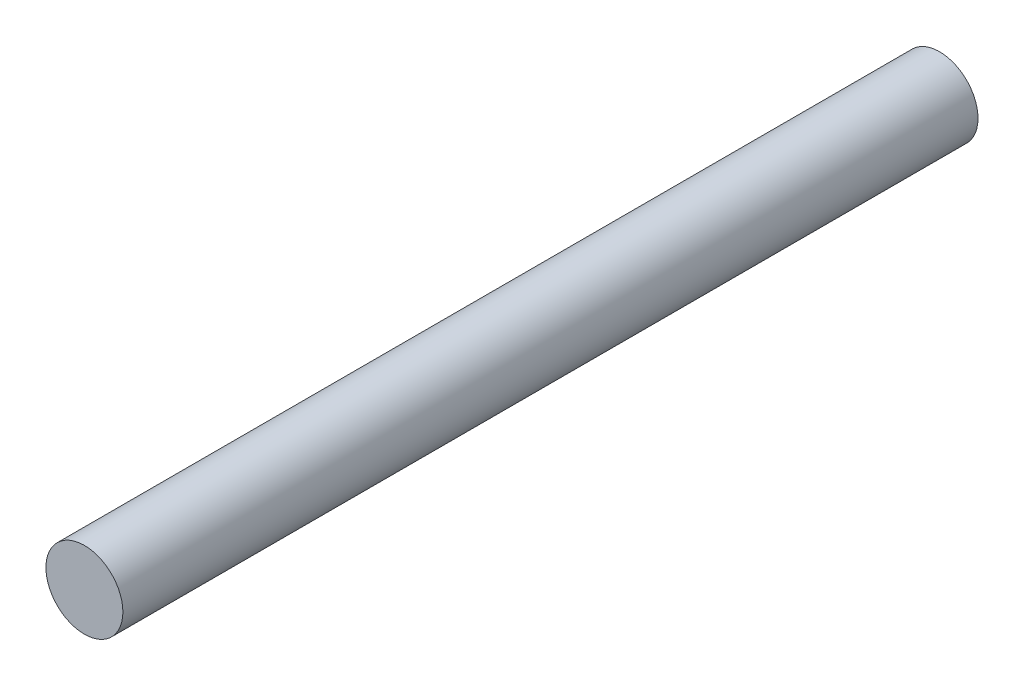
ISO-10303-21;
HEADER;
FILE_DESCRIPTION(('STEP AP214'),'2;1');
FILE_NAME('part.step','',(''),(''),'','','');
FILE_SCHEMA(('AUTOMOTIVE_DESIGN { 1 0 10303 214 1 1 1 1 }'));
ENDSEC;
DATA;
#1=APPLICATION_CONTEXT('core data for automotive mechanical design processes');
#2=APPLICATION_PROTOCOL_DEFINITION('international standard','automotive_design',2000,#1);
#3=PRODUCT_CONTEXT('',#1,'mechanical');
#4=PRODUCT('Part','Part','',(#3));
#5=PRODUCT_RELATED_PRODUCT_CATEGORY('part','',(#4));
#6=PRODUCT_DEFINITION_FORMATION('','',#4);
#7=PRODUCT_DEFINITION_CONTEXT('part definition',#1,'design');
#8=PRODUCT_DEFINITION('design','',#6,#7);
#9=PRODUCT_DEFINITION_SHAPE('','',#8);
#10=(LENGTH_UNIT() NAMED_UNIT(*) SI_UNIT(.MILLI.,.METRE.));
#11=(NAMED_UNIT(*) PLANE_ANGLE_UNIT() SI_UNIT($,.RADIAN.));
#12=(NAMED_UNIT(*) SI_UNIT($,.STERADIAN.) SOLID_ANGLE_UNIT());
#13=UNCERTAINTY_MEASURE_WITH_UNIT(LENGTH_MEASURE(1.E-05),#10,'distance_accuracy_value','');
#14=(GEOMETRIC_REPRESENTATION_CONTEXT(3) GLOBAL_UNCERTAINTY_ASSIGNED_CONTEXT((#13)) GLOBAL_UNIT_ASSIGNED_CONTEXT((#10,
#11,#12)) REPRESENTATION_CONTEXT('',''));
#15=CARTESIAN_POINT('',(0.,0.,0.));
#16=DIRECTION('',(0.,0.,1.));
#17=DIRECTION('',(1.,0.,0.));
#18=AXIS2_PLACEMENT_3D('',#15,#16,#17);
#19=CARTESIAN_POINT('',(0.,0.,22.225));
#20=DIRECTION('',(0.,0.,-1.));
#21=DIRECTION('',(-1.,0.,0.));
#22=AXIS2_PLACEMENT_3D('',#19,#20,#21);
#23=CYLINDRICAL_SURFACE('',#22,2.);
#24=CARTESIAN_POINT('',(0.,0.,22.225));
#25=DIRECTION('',(0.,0.,1.));
#26=DIRECTION('',(1.,0.,0.));
#27=AXIS2_PLACEMENT_3D('',#24,#25,#26);
#28=CIRCLE('',#27,2.);
#29=CARTESIAN_POINT('',(2.,0.,22.225));
#30=VERTEX_POINT('',#29);
#31=EDGE_CURVE('E10',#30,#30,#28,.T.);
#32=ORIENTED_EDGE('',*,*,#31,.F.);
#33=EDGE_LOOP('',(#32));
#34=FACE_BOUND('',#33,.T.);
#35=CARTESIAN_POINT('',(0.,0.,-22.225));
#36=DIRECTION('',(0.,0.,1.));
#37=DIRECTION('',(1.,0.,0.));
#38=AXIS2_PLACEMENT_3D('',#35,#36,#37);
#39=CIRCLE('',#38,2.);
#40=CARTESIAN_POINT('',(2.,0.,-22.225));
#41=VERTEX_POINT('',#40);
#42=EDGE_CURVE('E37',#41,#41,#39,.T.);
#43=ORIENTED_EDGE('',*,*,#42,.T.);
#44=EDGE_LOOP('',(#43));
#45=FACE_BOUND('',#44,.T.);
#46=ADVANCED_FACE('F34',(#34,#45),#23,.T.);
#47=CARTESIAN_POINT('',(0.,0.,22.225));
#48=DIRECTION('',(0.,0.,1.));
#49=DIRECTION('',(1.,0.,0.));
#50=AXIS2_PLACEMENT_3D('',#47,#48,#49);
#51=PLANE('',#50);
#52=ORIENTED_EDGE('',*,*,#31,.T.);
#53=EDGE_LOOP('',(#52));
#54=FACE_BOUND('',#53,.T.);
#55=ADVANCED_FACE('F49',(#54),#51,.T.);
#56=CARTESIAN_POINT('',(0.,0.,-22.225));
#57=DIRECTION('',(0.,0.,1.));
#58=DIRECTION('',(1.,0.,0.));
#59=AXIS2_PLACEMENT_3D('',#56,#57,#58);
#60=PLANE('',#59);
#61=ORIENTED_EDGE('',*,*,#42,.F.);
#62=EDGE_LOOP('',(#61));
#63=FACE_BOUND('',#62,.T.);
#64=ADVANCED_FACE('F47',(#63),#60,.F.);
#65=CLOSED_SHELL('',(#46,#55,#64));
#66=MANIFOLD_SOLID_BREP('B2',#65);
#67=ADVANCED_BREP_SHAPE_REPRESENTATION('',(#18,#66),#14);
#68=SHAPE_DEFINITION_REPRESENTATION(#9,#67);
ENDSEC;
END-ISO-10303-21;
